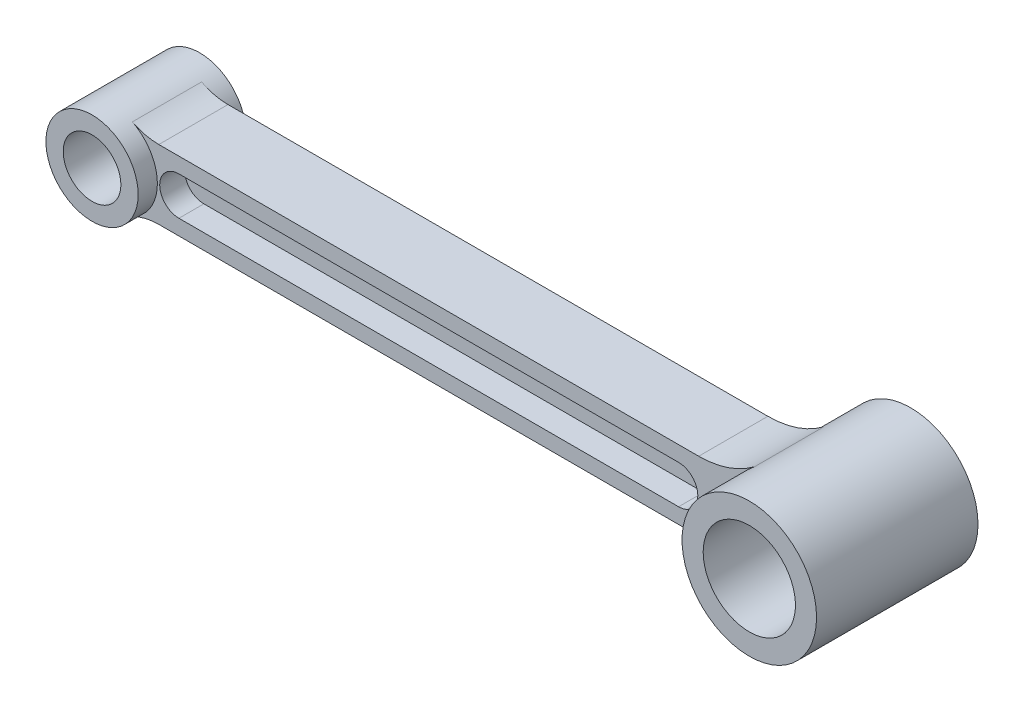
ISO-10303-21;
HEADER;
FILE_DESCRIPTION(('STEP AP214'),'2;1');
FILE_NAME('part.step','',(''),(''),'','','');
FILE_SCHEMA(('AUTOMOTIVE_DESIGN { 1 0 10303 214 1 1 1 1 }'));
ENDSEC;
DATA;
#1=APPLICATION_CONTEXT('core data for automotive mechanical design processes');
#2=APPLICATION_PROTOCOL_DEFINITION('international standard','automotive_design',2000,#1);
#3=PRODUCT_CONTEXT('',#1,'mechanical');
#4=PRODUCT('Part','Part','',(#3));
#5=PRODUCT_RELATED_PRODUCT_CATEGORY('part','',(#4));
#6=PRODUCT_DEFINITION_FORMATION('','',#4);
#7=PRODUCT_DEFINITION_CONTEXT('part definition',#1,'design');
#8=PRODUCT_DEFINITION('design','',#6,#7);
#9=PRODUCT_DEFINITION_SHAPE('','',#8);
#10=(LENGTH_UNIT() NAMED_UNIT(*) SI_UNIT(.MILLI.,.METRE.));
#11=(NAMED_UNIT(*) PLANE_ANGLE_UNIT() SI_UNIT($,.RADIAN.));
#12=(NAMED_UNIT(*) SI_UNIT($,.STERADIAN.) SOLID_ANGLE_UNIT());
#13=UNCERTAINTY_MEASURE_WITH_UNIT(LENGTH_MEASURE(1.E-05),#10,'distance_accuracy_value','');
#14=(GEOMETRIC_REPRESENTATION_CONTEXT(3) GLOBAL_UNCERTAINTY_ASSIGNED_CONTEXT((#13)) GLOBAL_UNIT_ASSIGNED_CONTEXT((#10,
#11,#12)) REPRESENTATION_CONTEXT('',''));
#15=CARTESIAN_POINT('',(0.,0.,0.));
#16=DIRECTION('',(0.,0.,1.));
#17=DIRECTION('',(1.,0.,0.));
#18=AXIS2_PLACEMENT_3D('',#15,#16,#17);
#19=CARTESIAN_POINT('',(0.,0.,-9.));
#20=DIRECTION('',(0.,0.,1.));
#21=DIRECTION('',(1.,0.,0.));
#22=AXIS2_PLACEMENT_3D('',#19,#20,#21);
#23=PLANE('',#22);
#24=CARTESIAN_POINT('',(-46.1087639211392,0.,-9.));
#25=DIRECTION('',(0.,0.,1.));
#26=DIRECTION('',(1.,0.,0.));
#27=AXIS2_PLACEMENT_3D('',#24,#25,#26);
#28=CIRCLE('',#27,12.);
#29=CARTESIAN_POINT('',(-40.611289753649,-10.6666666666667,-9.));
#30=VERTEX_POINT('',#29);
#31=CARTESIAN_POINT('',(-40.611289753649,10.6666666666667,-9.));
#32=VERTEX_POINT('',#31);
#33=EDGE_CURVE('E243',#30,#32,#28,.T.);
#34=ORIENTED_EDGE('',*,*,#33,.T.);
#35=CARTESIAN_POINT('',(-33.7394470442862,24.,-9.));
#36=DIRECTION('',(0.,0.,1.));
#37=DIRECTION('',(1.,0.,0.));
#38=AXIS2_PLACEMENT_3D('',#35,#36,#37);
#39=CIRCLE('',#38,15.);
#40=CARTESIAN_POINT('',(-33.7394470442862,9.,-9.));
#41=VERTEX_POINT('',#40);
#42=EDGE_CURVE('E251',#32,#41,#39,.T.);
#43=ORIENTED_EDGE('',*,*,#42,.T.);
#44=DIRECTION('',(1.,0.,0.));
#45=VECTOR('',#44,1.);
#46=CARTESIAN_POINT('',(0.,9.,-9.));
#47=LINE('',#46,#45);
#48=CARTESIAN_POINT('',(106.726777014538,9.,-9.));
#49=VERTEX_POINT('',#48);
#50=EDGE_CURVE('E298',#41,#49,#47,.T.);
#51=ORIENTED_EDGE('',*,*,#50,.T.);
#52=CARTESIAN_POINT('',(106.726777014538,33.,-9.));
#53=DIRECTION('',(0.,0.,1.));
#54=DIRECTION('',(1.,0.,0.));
#55=AXIS2_PLACEMENT_3D('',#52,#53,#54);
#56=CIRCLE('',#55,24.);
#57=CARTESIAN_POINT('',(121.279717196315,13.9156626506024,-9.));
#58=VERTEX_POINT('',#57);
#59=EDGE_CURVE('E294',#58,#49,#56,.F.);
#60=ORIENTED_EDGE('',*,*,#59,.F.);
#61=CARTESIAN_POINT('',(131.891236078861,0.,-9.));
#62=DIRECTION('',(0.,0.,1.));
#63=DIRECTION('',(1.,0.,0.));
#64=AXIS2_PLACEMENT_3D('',#61,#62,#63);
#65=CIRCLE('',#64,17.5);
#66=CARTESIAN_POINT('',(121.279717196315,-13.9156626506024,-9.));
#67=VERTEX_POINT('',#66);
#68=EDGE_CURVE('E290',#58,#67,#65,.T.);
#69=ORIENTED_EDGE('',*,*,#68,.T.);
#70=CARTESIAN_POINT('',(106.726777014538,-33.,-9.));
#71=DIRECTION('',(0.,0.,1.));
#72=DIRECTION('',(1.,0.,0.));
#73=AXIS2_PLACEMENT_3D('',#70,#71,#72);
#74=CIRCLE('',#73,24.);
#75=CARTESIAN_POINT('',(106.726777014538,-9.,-9.));
#76=VERTEX_POINT('',#75);
#77=EDGE_CURVE('E286',#67,#76,#74,.T.);
#78=ORIENTED_EDGE('',*,*,#77,.T.);
#79=DIRECTION('',(1.,0.,0.));
#80=VECTOR('',#79,1.);
#81=CARTESIAN_POINT('',(0.,-9.,-9.));
#82=LINE('',#81,#80);
#83=CARTESIAN_POINT('',(-33.7394470442862,-9.,-9.));
#84=VERTEX_POINT('',#83);
#85=EDGE_CURVE('E282',#84,#76,#82,.T.);
#86=ORIENTED_EDGE('',*,*,#85,.F.);
#87=CARTESIAN_POINT('',(-33.7394470442862,-24.,-9.));
#88=DIRECTION('',(0.,0.,1.));
#89=DIRECTION('',(1.,0.,0.));
#90=AXIS2_PLACEMENT_3D('',#87,#88,#89);
#91=CIRCLE('',#90,15.);
#92=EDGE_CURVE('E279',#30,#84,#91,.F.);
#93=ORIENTED_EDGE('',*,*,#92,.F.);
#94=EDGE_LOOP('',(#34,#43,#51,#60,#69,#78,#86,#93));
#95=FACE_BOUND('',#94,.T.);
#96=CARTESIAN_POINT('',(101.493664985126,0.,-9.));
#97=DIRECTION('',(0.,0.,1.));
#98=DIRECTION('',(1.,0.,0.));
#99=AXIS2_PLACEMENT_3D('',#96,#97,#98);
#100=CIRCLE('',#99,5.);
#101=CARTESIAN_POINT('',(101.493664985126,5.,-9.));
#102=VERTEX_POINT('',#101);
#103=CARTESIAN_POINT('',(101.493664985126,-5.,-9.));
#104=VERTEX_POINT('',#103);
#105=EDGE_CURVE('E356',#102,#104,#100,.F.);
#106=ORIENTED_EDGE('',*,*,#105,.F.);
#107=DIRECTION('',(1.,0.,0.));
#108=VECTOR('',#107,1.);
#109=CARTESIAN_POINT('',(0.,5.,-9.));
#110=LINE('',#109,#108);
#111=CARTESIAN_POINT('',(-28.5063350148743,5.,-9.));
#112=VERTEX_POINT('',#111);
#113=EDGE_CURVE('E341',#112,#102,#110,.T.);
#114=ORIENTED_EDGE('',*,*,#113,.F.);
#115=CARTESIAN_POINT('',(-28.5063350148743,0.,-9.));
#116=DIRECTION('',(0.,0.,1.));
#117=DIRECTION('',(1.,0.,0.));
#118=AXIS2_PLACEMENT_3D('',#115,#116,#117);
#119=CIRCLE('',#118,5.);
#120=CARTESIAN_POINT('',(-28.5063350148743,-5.,-9.));
#121=VERTEX_POINT('',#120);
#122=EDGE_CURVE('E350',#121,#112,#119,.F.);
#123=ORIENTED_EDGE('',*,*,#122,.F.);
#124=DIRECTION('',(-1.,0.,0.));
#125=VECTOR('',#124,1.);
#126=CARTESIAN_POINT('',(0.,-5.,-9.));
#127=LINE('',#126,#125);
#128=EDGE_CURVE('E353',#104,#121,#127,.T.);
#129=ORIENTED_EDGE('',*,*,#128,.F.);
#130=EDGE_LOOP('',(#106,#114,#123,#129));
#131=FACE_BOUND('',#130,.T.);
#132=ADVANCED_FACE('F51',(#95,#131),#23,.F.);
#133=CARTESIAN_POINT('',(-46.1087639211392,0.,14.));
#134=DIRECTION('',(0.,0.,-1.));
#135=DIRECTION('',(-1.,0.,0.));
#136=AXIS2_PLACEMENT_3D('',#133,#134,#135);
#137=CYLINDRICAL_SURFACE('',#136,12.);
#138=DIRECTION('',(0.,0.,-1.));
#139=VECTOR('',#138,1.);
#140=CARTESIAN_POINT('',(-40.611289753649,-10.6666666666667,9.));
#141=LINE('',#140,#139);
#142=CARTESIAN_POINT('',(-40.611289753649,-10.6666666666667,9.));
#143=VERTEX_POINT('',#142);
#144=EDGE_CURVE('E327',#143,#30,#141,.T.);
#145=ORIENTED_EDGE('',*,*,#144,.F.);
#146=CARTESIAN_POINT('',(-46.1087639211392,0.,9.));
#147=DIRECTION('',(0.,0.,1.));
#148=DIRECTION('',(1.,0.,0.));
#149=AXIS2_PLACEMENT_3D('',#146,#147,#148);
#150=CIRCLE('',#149,12.);
#151=CARTESIAN_POINT('',(-40.611289753649,10.6666666666667,9.));
#152=VERTEX_POINT('',#151);
#153=EDGE_CURVE('E247',#143,#152,#150,.T.);
#154=ORIENTED_EDGE('',*,*,#153,.T.);
#155=DIRECTION('',(0.,0.,-1.));
#156=VECTOR('',#155,1.);
#157=CARTESIAN_POINT('',(-40.611289753649,10.6666666666667,9.));
#158=LINE('',#157,#156);
#159=EDGE_CURVE('E275',#152,#32,#158,.T.);
#160=ORIENTED_EDGE('',*,*,#159,.T.);
#161=ORIENTED_EDGE('',*,*,#33,.F.);
#162=EDGE_LOOP('',(#145,#154,#160,#161));
#163=FACE_BOUND('',#162,.T.);
#164=CARTESIAN_POINT('',(-46.1087639211392,0.,14.));
#165=DIRECTION('',(0.,0.,1.));
#166=DIRECTION('',(1.,0.,0.));
#167=AXIS2_PLACEMENT_3D('',#164,#165,#166);
#168=CIRCLE('',#167,12.);
#169=CARTESIAN_POINT('',(-34.1087639211392,0.,14.));
#170=VERTEX_POINT('',#169);
#171=EDGE_CURVE('E332',#170,#170,#168,.T.);
#172=ORIENTED_EDGE('',*,*,#171,.F.);
#173=EDGE_LOOP('',(#172));
#174=FACE_BOUND('',#173,.T.);
#175=CARTESIAN_POINT('',(-46.1087639211392,0.,-14.));
#176=DIRECTION('',(0.,0.,1.));
#177=DIRECTION('',(1.,0.,0.));
#178=AXIS2_PLACEMENT_3D('',#175,#176,#177);
#179=CIRCLE('',#178,12.);
#180=CARTESIAN_POINT('',(-34.1087639211392,0.,-14.));
#181=VERTEX_POINT('',#180);
#182=EDGE_CURVE('E331',#181,#181,#179,.T.);
#183=ORIENTED_EDGE('',*,*,#182,.T.);
#184=EDGE_LOOP('',(#183));
#185=FACE_BOUND('',#184,.T.);
#186=ADVANCED_FACE('F53',(#163,#174,#185),#137,.T.);
#187=CARTESIAN_POINT('',(-46.1087639211392,0.,14.));
#188=DIRECTION('',(0.,0.,-1.));
#189=DIRECTION('',(-1.,0.,0.));
#190=AXIS2_PLACEMENT_3D('',#187,#188,#189);
#191=CYLINDRICAL_SURFACE('',#190,7.5);
#192=CARTESIAN_POINT('',(-46.1087639211392,0.,14.));
#193=DIRECTION('',(0.,0.,1.));
#194=DIRECTION('',(1.,0.,0.));
#195=AXIS2_PLACEMENT_3D('',#192,#193,#194);
#196=CIRCLE('',#195,7.5);
#197=CARTESIAN_POINT('',(-38.6087639211392,0.,14.));
#198=VERTEX_POINT('',#197);
#199=EDGE_CURVE('E336',#198,#198,#196,.T.);
#200=ORIENTED_EDGE('',*,*,#199,.T.);
#201=EDGE_LOOP('',(#200));
#202=FACE_BOUND('',#201,.T.);
#203=CARTESIAN_POINT('',(-46.1087639211392,0.,-14.));
#204=DIRECTION('',(0.,0.,1.));
#205=DIRECTION('',(1.,0.,0.));
#206=AXIS2_PLACEMENT_3D('',#203,#204,#205);
#207=CIRCLE('',#206,7.5);
#208=CARTESIAN_POINT('',(-38.6087639211392,0.,-14.));
#209=VERTEX_POINT('',#208);
#210=EDGE_CURVE('E337',#209,#209,#207,.T.);
#211=ORIENTED_EDGE('',*,*,#210,.F.);
#212=EDGE_LOOP('',(#211));
#213=FACE_BOUND('',#212,.T.);
#214=ADVANCED_FACE('F387',(#202,#213),#191,.F.);
#215=CARTESIAN_POINT('',(0.,0.,14.));
#216=DIRECTION('',(0.,0.,1.));
#217=DIRECTION('',(1.,0.,0.));
#218=AXIS2_PLACEMENT_3D('',#215,#216,#217);
#219=PLANE('',#218);
#220=ORIENTED_EDGE('',*,*,#171,.T.);
#221=EDGE_LOOP('',(#220));
#222=FACE_BOUND('',#221,.T.);
#223=ORIENTED_EDGE('',*,*,#199,.F.);
#224=EDGE_LOOP('',(#223));
#225=FACE_BOUND('',#224,.T.);
#226=ADVANCED_FACE('F418',(#222,#225),#219,.T.);
#227=CARTESIAN_POINT('',(0.,0.,-14.));
#228=DIRECTION('',(0.,0.,1.));
#229=DIRECTION('',(1.,0.,0.));
#230=AXIS2_PLACEMENT_3D('',#227,#228,#229);
#231=PLANE('',#230);
#232=ORIENTED_EDGE('',*,*,#182,.F.);
#233=EDGE_LOOP('',(#232));
#234=FACE_BOUND('',#233,.T.);
#235=ORIENTED_EDGE('',*,*,#210,.T.);
#236=EDGE_LOOP('',(#235));
#237=FACE_BOUND('',#236,.T.);
#238=ADVANCED_FACE('F416',(#234,#237),#231,.F.);
#239=CARTESIAN_POINT('',(-33.7394470442862,-24.,9.));
#240=DIRECTION('',(0.,0.,-1.));
#241=DIRECTION('',(-1.,0.,0.));
#242=AXIS2_PLACEMENT_3D('',#239,#240,#241);
#243=CYLINDRICAL_SURFACE('',#242,15.);
#244=ORIENTED_EDGE('',*,*,#92,.T.);
#245=DIRECTION('',(0.,0.,-1.));
#246=VECTOR('',#245,1.);
#247=CARTESIAN_POINT('',(-33.7394470442862,-9.,9.));
#248=LINE('',#247,#246);
#249=CARTESIAN_POINT('',(-33.7394470442862,-9.,9.));
#250=VERTEX_POINT('',#249);
#251=EDGE_CURVE('E323',#250,#84,#248,.T.);
#252=ORIENTED_EDGE('',*,*,#251,.F.);
#253=CARTESIAN_POINT('',(-33.7394470442862,-24.,9.));
#254=DIRECTION('',(0.,0.,1.));
#255=DIRECTION('',(1.,0.,0.));
#256=AXIS2_PLACEMENT_3D('',#253,#254,#255);
#257=CIRCLE('',#256,15.);
#258=EDGE_CURVE('E250',#143,#250,#257,.F.);
#259=ORIENTED_EDGE('',*,*,#258,.F.);
#260=ORIENTED_EDGE('',*,*,#144,.T.);
#261=EDGE_LOOP('',(#244,#252,#259,#260));
#262=FACE_BOUND('',#261,.T.);
#263=ADVANCED_FACE('F412',(#262),#243,.F.);
#264=CARTESIAN_POINT('',(0.,-9.,9.));
#265=DIRECTION('',(0.,1.,0.));
#266=DIRECTION('',(-1.,0.,0.));
#267=AXIS2_PLACEMENT_3D('',#264,#265,#266);
#268=PLANE('',#267);
#269=ORIENTED_EDGE('',*,*,#85,.T.);
#270=DIRECTION('',(0.,0.,-1.));
#271=VECTOR('',#270,1.);
#272=CARTESIAN_POINT('',(106.726777014538,-9.,9.));
#273=LINE('',#272,#271);
#274=CARTESIAN_POINT('',(106.726777014538,-9.,9.));
#275=VERTEX_POINT('',#274);
#276=EDGE_CURVE('E320',#275,#76,#273,.T.);
#277=ORIENTED_EDGE('',*,*,#276,.F.);
#278=DIRECTION('',(1.,0.,0.));
#279=VECTOR('',#278,1.);
#280=CARTESIAN_POINT('',(0.,-9.,9.));
#281=LINE('',#280,#279);
#282=EDGE_CURVE('E254',#250,#275,#281,.T.);
#283=ORIENTED_EDGE('',*,*,#282,.F.);
#284=ORIENTED_EDGE('',*,*,#251,.T.);
#285=EDGE_LOOP('',(#269,#277,#283,#284));
#286=FACE_BOUND('',#285,.T.);
#287=ADVANCED_FACE('F408',(#286),#268,.F.);
#288=CARTESIAN_POINT('',(106.726777014538,-33.,9.));
#289=DIRECTION('',(0.,0.,-1.));
#290=DIRECTION('',(-1.,0.,0.));
#291=AXIS2_PLACEMENT_3D('',#288,#289,#290);
#292=CYLINDRICAL_SURFACE('',#291,24.);
#293=ORIENTED_EDGE('',*,*,#77,.F.);
#294=DIRECTION('',(0.,0.,-1.));
#295=VECTOR('',#294,1.);
#296=CARTESIAN_POINT('',(121.279717196315,-13.9156626506024,9.));
#297=LINE('',#296,#295);
#298=CARTESIAN_POINT('',(121.279717196315,-13.9156626506024,9.));
#299=VERTEX_POINT('',#298);
#300=EDGE_CURVE('E317',#299,#67,#297,.T.);
#301=ORIENTED_EDGE('',*,*,#300,.F.);
#302=CARTESIAN_POINT('',(106.726777014538,-33.,9.));
#303=DIRECTION('',(0.,0.,1.));
#304=DIRECTION('',(1.,0.,0.));
#305=AXIS2_PLACEMENT_3D('',#302,#303,#304);
#306=CIRCLE('',#305,24.);
#307=EDGE_CURVE('E257',#299,#275,#306,.T.);
#308=ORIENTED_EDGE('',*,*,#307,.T.);
#309=ORIENTED_EDGE('',*,*,#276,.T.);
#310=EDGE_LOOP('',(#293,#301,#308,#309));
#311=FACE_BOUND('',#310,.T.);
#312=ADVANCED_FACE('F404',(#311),#292,.F.);
#313=CARTESIAN_POINT('',(106.726777014538,33.,9.));
#314=DIRECTION('',(0.,0.,-1.));
#315=DIRECTION('',(-1.,0.,0.));
#316=AXIS2_PLACEMENT_3D('',#313,#314,#315);
#317=CYLINDRICAL_SURFACE('',#316,24.);
#318=ORIENTED_EDGE('',*,*,#59,.T.);
#319=DIRECTION('',(0.,0.,-1.));
#320=VECTOR('',#319,1.);
#321=CARTESIAN_POINT('',(106.726777014538,9.,9.));
#322=LINE('',#321,#320);
#323=CARTESIAN_POINT('',(106.726777014538,9.,9.));
#324=VERTEX_POINT('',#323);
#325=EDGE_CURVE('E310',#324,#49,#322,.T.);
#326=ORIENTED_EDGE('',*,*,#325,.F.);
#327=CARTESIAN_POINT('',(106.726777014538,33.,9.));
#328=DIRECTION('',(0.,0.,1.));
#329=DIRECTION('',(1.,0.,0.));
#330=AXIS2_PLACEMENT_3D('',#327,#328,#329);
#331=CIRCLE('',#330,24.);
#332=CARTESIAN_POINT('',(121.279717196315,13.9156626506024,9.));
#333=VERTEX_POINT('',#332);
#334=EDGE_CURVE('E264',#333,#324,#331,.F.);
#335=ORIENTED_EDGE('',*,*,#334,.F.);
#336=DIRECTION('',(0.,0.,-1.));
#337=VECTOR('',#336,1.);
#338=CARTESIAN_POINT('',(121.279717196315,13.9156626506024,9.));
#339=LINE('',#338,#337);
#340=EDGE_CURVE('E313',#333,#58,#339,.T.);
#341=ORIENTED_EDGE('',*,*,#340,.T.);
#342=EDGE_LOOP('',(#318,#326,#335,#341));
#343=FACE_BOUND('',#342,.T.);
#344=ADVANCED_FACE('F400',(#343),#317,.F.);
#345=CARTESIAN_POINT('',(0.,9.,9.));
#346=DIRECTION('',(0.,1.,0.));
#347=DIRECTION('',(-1.,0.,0.));
#348=AXIS2_PLACEMENT_3D('',#345,#346,#347);
#349=PLANE('',#348);
#350=ORIENTED_EDGE('',*,*,#50,.F.);
#351=DIRECTION('',(0.,0.,-1.));
#352=VECTOR('',#351,1.);
#353=CARTESIAN_POINT('',(-33.7394470442862,9.,9.));
#354=LINE('',#353,#352);
#355=CARTESIAN_POINT('',(-33.7394470442862,9.,9.));
#356=VERTEX_POINT('',#355);
#357=EDGE_CURVE('E307',#356,#41,#354,.T.);
#358=ORIENTED_EDGE('',*,*,#357,.F.);
#359=DIRECTION('',(1.,0.,0.));
#360=VECTOR('',#359,1.);
#361=CARTESIAN_POINT('',(0.,9.,9.));
#362=LINE('',#361,#360);
#363=EDGE_CURVE('E267',#356,#324,#362,.T.);
#364=ORIENTED_EDGE('',*,*,#363,.T.);
#365=ORIENTED_EDGE('',*,*,#325,.T.);
#366=EDGE_LOOP('',(#350,#358,#364,#365));
#367=FACE_BOUND('',#366,.T.);
#368=ADVANCED_FACE('F396',(#367),#349,.T.);
#369=CARTESIAN_POINT('',(-33.7394470442862,24.,9.));
#370=DIRECTION('',(0.,0.,-1.));
#371=DIRECTION('',(-1.,0.,0.));
#372=AXIS2_PLACEMENT_3D('',#369,#370,#371);
#373=CYLINDRICAL_SURFACE('',#372,15.);
#374=ORIENTED_EDGE('',*,*,#42,.F.);
#375=ORIENTED_EDGE('',*,*,#159,.F.);
#376=CARTESIAN_POINT('',(-33.7394470442862,24.,9.));
#377=DIRECTION('',(0.,0.,1.));
#378=DIRECTION('',(1.,0.,0.));
#379=AXIS2_PLACEMENT_3D('',#376,#377,#378);
#380=CIRCLE('',#379,15.);
#381=EDGE_CURVE('E271',#152,#356,#380,.T.);
#382=ORIENTED_EDGE('',*,*,#381,.T.);
#383=ORIENTED_EDGE('',*,*,#357,.T.);
#384=EDGE_LOOP('',(#374,#375,#382,#383));
#385=FACE_BOUND('',#384,.T.);
#386=ADVANCED_FACE('F393',(#385),#373,.F.);
#387=CARTESIAN_POINT('',(0.,0.,9.));
#388=DIRECTION('',(0.,0.,1.));
#389=DIRECTION('',(1.,0.,0.));
#390=AXIS2_PLACEMENT_3D('',#387,#388,#389);
#391=PLANE('',#390);
#392=CARTESIAN_POINT('',(101.493664985126,0.,9.));
#393=DIRECTION('',(0.,0.,1.));
#394=DIRECTION('',(1.,0.,0.));
#395=AXIS2_PLACEMENT_3D('',#392,#393,#394);
#396=CIRCLE('',#395,5.);
#397=CARTESIAN_POINT('',(101.493664985126,-5.,9.));
#398=VERTEX_POINT('',#397);
#399=CARTESIAN_POINT('',(101.493664985126,5.,9.));
#400=VERTEX_POINT('',#399);
#401=EDGE_CURVE('E12',#398,#400,#396,.T.);
#402=ORIENTED_EDGE('',*,*,#401,.F.);
#403=DIRECTION('',(1.,0.,0.));
#404=VECTOR('',#403,1.);
#405=CARTESIAN_POINT('',(0.,-5.,9.));
#406=LINE('',#405,#404);
#407=CARTESIAN_POINT('',(-28.5063350148743,-5.,9.));
#408=VERTEX_POINT('',#407);
#409=EDGE_CURVE('E359',#408,#398,#406,.T.);
#410=ORIENTED_EDGE('',*,*,#409,.F.);
#411=CARTESIAN_POINT('',(-28.5063350148743,0.,9.));
#412=DIRECTION('',(0.,0.,1.));
#413=DIRECTION('',(1.,0.,0.));
#414=AXIS2_PLACEMENT_3D('',#411,#412,#413);
#415=CIRCLE('',#414,5.);
#416=CARTESIAN_POINT('',(-28.5063350148743,5.,9.));
#417=VERTEX_POINT('',#416);
#418=EDGE_CURVE('E362',#417,#408,#415,.T.);
#419=ORIENTED_EDGE('',*,*,#418,.F.);
#420=DIRECTION('',(-1.,0.,0.));
#421=VECTOR('',#420,1.);
#422=CARTESIAN_POINT('',(0.,5.,9.));
#423=LINE('',#422,#421);
#424=EDGE_CURVE('E60',#400,#417,#423,.T.);
#425=ORIENTED_EDGE('',*,*,#424,.F.);
#426=EDGE_LOOP('',(#402,#410,#419,#425));
#427=FACE_BOUND('',#426,.T.);
#428=ORIENTED_EDGE('',*,*,#153,.F.);
#429=ORIENTED_EDGE('',*,*,#258,.T.);
#430=ORIENTED_EDGE('',*,*,#282,.T.);
#431=ORIENTED_EDGE('',*,*,#307,.F.);
#432=CARTESIAN_POINT('',(131.891236078861,0.,9.));
#433=DIRECTION('',(0.,0.,1.));
#434=DIRECTION('',(1.,0.,0.));
#435=AXIS2_PLACEMENT_3D('',#432,#433,#434);
#436=CIRCLE('',#435,17.5);
#437=EDGE_CURVE('E261',#333,#299,#436,.T.);
#438=ORIENTED_EDGE('',*,*,#437,.F.);
#439=ORIENTED_EDGE('',*,*,#334,.T.);
#440=ORIENTED_EDGE('',*,*,#363,.F.);
#441=ORIENTED_EDGE('',*,*,#381,.F.);
#442=EDGE_LOOP('',(#428,#429,#430,#431,#438,#439,#440,#441));
#443=FACE_BOUND('',#442,.T.);
#444=ADVANCED_FACE('F370',(#427,#443),#391,.T.);
#445=CARTESIAN_POINT('',(131.891236078861,0.,21.));
#446=DIRECTION('',(0.,0.,1.));
#447=DIRECTION('',(1.,0.,0.));
#448=AXIS2_PLACEMENT_3D('',#445,#446,#447);
#449=PLANE('',#448);
#450=CARTESIAN_POINT('',(131.891236078861,0.,21.));
#451=DIRECTION('',(0.,0.,1.));
#452=DIRECTION('',(1.,0.,0.));
#453=AXIS2_PLACEMENT_3D('',#450,#451,#452);
#454=CIRCLE('',#453,17.5);
#455=CARTESIAN_POINT('',(149.391236078861,0.,21.));
#456=VERTEX_POINT('',#455);
#457=EDGE_CURVE('E239',#456,#456,#454,.T.);
#458=ORIENTED_EDGE('',*,*,#457,.T.);
#459=EDGE_LOOP('',(#458));
#460=FACE_BOUND('',#459,.T.);
#461=CARTESIAN_POINT('',(131.891236078861,0.,21.));
#462=DIRECTION('',(0.,0.,1.));
#463=DIRECTION('',(1.,0.,0.));
#464=AXIS2_PLACEMENT_3D('',#461,#462,#463);
#465=CIRCLE('',#464,12.);
#466=CARTESIAN_POINT('',(119.891236078861,0.,21.));
#467=VERTEX_POINT('',#466);
#468=EDGE_CURVE('E231',#467,#467,#465,.T.);
#469=ORIENTED_EDGE('',*,*,#468,.F.);
#470=EDGE_LOOP('',(#469));
#471=FACE_BOUND('',#470,.T.);
#472=ADVANCED_FACE('F474',(#460,#471),#449,.T.);
#473=CARTESIAN_POINT('',(131.891236078861,0.,-21.));
#474=DIRECTION('',(0.,0.,1.));
#475=DIRECTION('',(1.,0.,0.));
#476=AXIS2_PLACEMENT_3D('',#473,#474,#475);
#477=PLANE('',#476);
#478=CARTESIAN_POINT('',(131.891236078861,0.,-21.));
#479=DIRECTION('',(0.,0.,1.));
#480=DIRECTION('',(1.,0.,0.));
#481=AXIS2_PLACEMENT_3D('',#478,#479,#480);
#482=CIRCLE('',#481,17.5);
#483=CARTESIAN_POINT('',(149.391236078861,0.,-21.));
#484=VERTEX_POINT('',#483);
#485=EDGE_CURVE('E235',#484,#484,#482,.T.);
#486=ORIENTED_EDGE('',*,*,#485,.F.);
#487=EDGE_LOOP('',(#486));
#488=FACE_BOUND('',#487,.T.);
#489=CARTESIAN_POINT('',(131.891236078861,0.,-21.));
#490=DIRECTION('',(0.,0.,1.));
#491=DIRECTION('',(1.,0.,0.));
#492=AXIS2_PLACEMENT_3D('',#489,#490,#491);
#493=CIRCLE('',#492,12.);
#494=CARTESIAN_POINT('',(119.891236078861,0.,-21.));
#495=VERTEX_POINT('',#494);
#496=EDGE_CURVE('E230',#495,#495,#493,.T.);
#497=ORIENTED_EDGE('',*,*,#496,.T.);
#498=EDGE_LOOP('',(#497));
#499=FACE_BOUND('',#498,.T.);
#500=ADVANCED_FACE('F481',(#488,#499),#477,.F.);
#501=CARTESIAN_POINT('',(131.891236078861,0.,21.));
#502=DIRECTION('',(0.,0.,-1.));
#503=DIRECTION('',(-1.,0.,0.));
#504=AXIS2_PLACEMENT_3D('',#501,#502,#503);
#505=CYLINDRICAL_SURFACE('',#504,17.5);
#506=ORIENTED_EDGE('',*,*,#437,.T.);
#507=ORIENTED_EDGE('',*,*,#300,.T.);
#508=ORIENTED_EDGE('',*,*,#68,.F.);
#509=ORIENTED_EDGE('',*,*,#340,.F.);
#510=EDGE_LOOP('',(#506,#507,#508,#509));
#511=FACE_BOUND('',#510,.T.);
#512=ORIENTED_EDGE('',*,*,#457,.F.);
#513=EDGE_LOOP('',(#512));
#514=FACE_BOUND('',#513,.T.);
#515=ORIENTED_EDGE('',*,*,#485,.T.);
#516=EDGE_LOOP('',(#515));
#517=FACE_BOUND('',#516,.T.);
#518=ADVANCED_FACE('F489',(#511,#514,#517),#505,.T.);
#519=CARTESIAN_POINT('',(131.891236078861,0.,21.));
#520=DIRECTION('',(0.,0.,-1.));
#521=DIRECTION('',(-1.,0.,0.));
#522=AXIS2_PLACEMENT_3D('',#519,#520,#521);
#523=CYLINDRICAL_SURFACE('',#522,12.);
#524=CARTESIAN_POINT('',(119.891236078861,0.,21.));
#525=CARTESIAN_POINT('',(119.891236078861,0.,20.5625));
#526=CARTESIAN_POINT('',(119.891236078861,0.,20.125));
#527=CARTESIAN_POINT('',(119.891236078861,0.,19.25));
#528=CARTESIAN_POINT('',(119.891236078861,0.,18.8125));
#529=CARTESIAN_POINT('',(119.891236078861,0.,17.9375));
#530=CARTESIAN_POINT('',(119.891236078861,0.,17.5));
#531=CARTESIAN_POINT('',(119.891236078861,0.,16.625));
#532=CARTESIAN_POINT('',(119.891236078861,0.,16.1875));
#533=CARTESIAN_POINT('',(119.891236078861,0.,15.3125));
#534=CARTESIAN_POINT('',(119.891236078861,0.,14.875));
#535=CARTESIAN_POINT('',(119.891236078861,0.,14.));
#536=CARTESIAN_POINT('',(119.891236078861,0.,13.5625));
#537=CARTESIAN_POINT('',(119.891236078861,0.,12.6875));
#538=CARTESIAN_POINT('',(119.891236078861,0.,12.25));
#539=CARTESIAN_POINT('',(119.891236078861,0.,11.375));
#540=CARTESIAN_POINT('',(119.891236078861,0.,10.9375));
#541=CARTESIAN_POINT('',(119.891236078861,0.,10.0625));
#542=CARTESIAN_POINT('',(119.891236078861,0.,9.625));
#543=CARTESIAN_POINT('',(119.891236078861,0.,8.75));
#544=CARTESIAN_POINT('',(119.891236078861,0.,8.3125));
#545=CARTESIAN_POINT('',(119.891236078861,0.,7.4375));
#546=CARTESIAN_POINT('',(119.891236078861,0.,7.));
#547=CARTESIAN_POINT('',(119.891236078861,0.,6.125));
#548=CARTESIAN_POINT('',(119.891236078861,0.,5.6875));
#549=CARTESIAN_POINT('',(119.891236078861,0.,4.8125));
#550=CARTESIAN_POINT('',(119.891236078861,0.,4.375));
#551=CARTESIAN_POINT('',(119.891236078861,0.,3.5));
#552=CARTESIAN_POINT('',(119.891236078861,0.,3.0625));
#553=CARTESIAN_POINT('',(119.891236078861,0.,2.1875));
#554=CARTESIAN_POINT('',(119.891236078861,0.,1.75));
#555=CARTESIAN_POINT('',(119.891236078861,0.,0.874999999999997));
#556=CARTESIAN_POINT('',(119.891236078861,0.,0.437499999999997));
#557=CARTESIAN_POINT('',(119.891236078861,0.,-0.437500000000004));
#558=CARTESIAN_POINT('',(119.891236078861,0.,-0.875000000000004));
#559=CARTESIAN_POINT('',(119.891236078861,0.,-1.75000000000001));
#560=CARTESIAN_POINT('',(119.891236078861,0.,-2.18750000000001));
#561=CARTESIAN_POINT('',(119.891236078861,0.,-3.0625));
#562=CARTESIAN_POINT('',(119.891236078861,0.,-3.5));
#563=CARTESIAN_POINT('',(119.891236078861,0.,-4.375));
#564=CARTESIAN_POINT('',(119.891236078861,0.,-4.8125));
#565=CARTESIAN_POINT('',(119.891236078861,0.,-5.68750000000001));
#566=CARTESIAN_POINT('',(119.891236078861,0.,-6.12500000000001));
#567=CARTESIAN_POINT('',(119.891236078861,0.,-7.00000000000001));
#568=CARTESIAN_POINT('',(119.891236078861,0.,-7.4375));
#569=CARTESIAN_POINT('',(119.891236078861,0.,-8.3125));
#570=CARTESIAN_POINT('',(119.891236078861,0.,-8.75));
#571=CARTESIAN_POINT('',(119.891236078861,0.,-9.625));
#572=CARTESIAN_POINT('',(119.891236078861,0.,-10.0625));
#573=CARTESIAN_POINT('',(119.891236078861,0.,-10.9375));
#574=CARTESIAN_POINT('',(119.891236078861,0.,-11.375));
#575=CARTESIAN_POINT('',(119.891236078861,0.,-12.25));
#576=CARTESIAN_POINT('',(119.891236078861,0.,-12.6875));
#577=CARTESIAN_POINT('',(119.891236078861,0.,-13.5625));
#578=CARTESIAN_POINT('',(119.891236078861,0.,-14.));
#579=CARTESIAN_POINT('',(119.891236078861,0.,-14.875));
#580=CARTESIAN_POINT('',(119.891236078861,0.,-15.3125));
#581=CARTESIAN_POINT('',(119.891236078861,0.,-16.1875));
#582=CARTESIAN_POINT('',(119.891236078861,0.,-16.625));
#583=CARTESIAN_POINT('',(119.891236078861,0.,-17.5));
#584=CARTESIAN_POINT('',(119.891236078861,0.,-17.9375));
#585=CARTESIAN_POINT('',(119.891236078861,0.,-18.8125));
#586=CARTESIAN_POINT('',(119.891236078861,0.,-19.25));
#587=CARTESIAN_POINT('',(119.891236078861,0.,-20.125));
#588=CARTESIAN_POINT('',(119.891236078861,0.,-20.5625));
#589=CARTESIAN_POINT('',(119.891236078861,0.,-21.));
#590=B_SPLINE_CURVE_WITH_KNOTS('',3,(#524,#525,#526,#527,#528,#529,#530,#531,#532,#533,#534,
#535,#536,#537,#538,#539,#540,#541,#542,#543,#544,#545,#546,#547,#548,#549,#550,#551,#552,#553,
#554,#555,#556,#557,#558,#559,#560,#561,#562,#563,#564,#565,#566,#567,#568,#569,#570,#571,#572,
#573,#574,#575,#576,#577,#578,#579,#580,#581,#582,#583,#584,#585,#586,#587,#588,#589),
.UNSPECIFIED.,.F.,.F.,(4,2,2,2,2,2,2,2,2,2,2,2,2,2,2,2,2,2,2,2,2,2,2,2,2,2,2,2,2,2,2,2,4),(0.,
1.3125,2.625,3.9375,5.25,6.5625,7.875,9.1875,10.5,11.8125,13.125,14.4375,15.75,17.0625,18.375,
19.6875,21.,22.3125,23.625,24.9375,26.25,27.5625,28.875,30.1875,31.5,32.8125,34.125,35.4375,
36.75,38.0625,39.375,40.6875,42.),.UNSPECIFIED.);
#591=EDGE_CURVE('BSEAM497',#467,#495,#590,.T.);
#592=ORIENTED_EDGE('',*,*,#468,.T.);
#593=ORIENTED_EDGE('',*,*,#496,.F.);
#594=ORIENTED_EDGE('',*,*,#591,.T.);
#595=ORIENTED_EDGE('',*,*,#591,.F.);
#596=EDGE_LOOP('',(#592,#594,#593,#595));
#597=FACE_BOUND('',#596,.T.);
#598=ADVANCED_FACE('F497',(#597),#523,.F.);
#599=CARTESIAN_POINT('',(101.493664985126,0.,-20.5));
#600=DIRECTION('',(0.,0.,1.));
#601=DIRECTION('',(1.,0.,0.));
#602=AXIS2_PLACEMENT_3D('',#599,#600,#601);
#603=CYLINDRICAL_SURFACE('',#602,5.);
#604=ORIENTED_EDGE('',*,*,#105,.T.);
#605=DIRECTION('',(0.,0.,1.));
#606=VECTOR('',#605,1.);
#607=CARTESIAN_POINT('',(101.493664985126,-5.,-20.5));
#608=LINE('',#607,#606);
#609=CARTESIAN_POINT('',(101.493664985126,-5.,-2.5));
#610=VERTEX_POINT('',#609);
#611=EDGE_CURVE('E227',#104,#610,#608,.T.);
#612=ORIENTED_EDGE('',*,*,#611,.T.);
#613=CARTESIAN_POINT('',(101.493664985126,0.,-2.5));
#614=DIRECTION('',(0.,0.,-1.));
#615=DIRECTION('',(-1.,0.,0.));
#616=AXIS2_PLACEMENT_3D('',#613,#614,#615);
#617=CIRCLE('',#616,5.);
#618=CARTESIAN_POINT('',(101.493664985126,5.,-2.5));
#619=VERTEX_POINT('',#618);
#620=EDGE_CURVE('E175',#619,#610,#617,.T.);
#621=ORIENTED_EDGE('',*,*,#620,.F.);
#622=DIRECTION('',(0.,0.,1.));
#623=VECTOR('',#622,1.);
#624=CARTESIAN_POINT('',(101.493664985126,5.,-20.5));
#625=LINE('',#624,#623);
#626=EDGE_CURVE('E219',#102,#619,#625,.T.);
#627=ORIENTED_EDGE('',*,*,#626,.F.);
#628=EDGE_LOOP('',(#604,#612,#621,#627));
#629=FACE_BOUND('',#628,.T.);
#630=ADVANCED_FACE('F504',(#629),#603,.F.);
#631=CARTESIAN_POINT('',(101.493664985126,-5.,-20.5));
#632=DIRECTION('',(0.,1.,0.));
#633=DIRECTION('',(0.,0.,1.));
#634=AXIS2_PLACEMENT_3D('',#631,#632,#633);
#635=PLANE('',#634);
#636=ORIENTED_EDGE('',*,*,#128,.T.);
#637=DIRECTION('',(0.,0.,1.));
#638=VECTOR('',#637,1.);
#639=CARTESIAN_POINT('',(-28.5063350148743,-5.,-20.5));
#640=LINE('',#639,#638);
#641=CARTESIAN_POINT('',(-28.5063350148743,-5.,-2.5));
#642=VERTEX_POINT('',#641);
#643=EDGE_CURVE('E224',#121,#642,#640,.T.);
#644=ORIENTED_EDGE('',*,*,#643,.T.);
#645=DIRECTION('',(-1.,0.,0.));
#646=VECTOR('',#645,1.);
#647=CARTESIAN_POINT('',(101.493664985126,-5.,-2.5));
#648=LINE('',#647,#646);
#649=EDGE_CURVE('E207',#610,#642,#648,.T.);
#650=ORIENTED_EDGE('',*,*,#649,.F.);
#651=ORIENTED_EDGE('',*,*,#611,.F.);
#652=EDGE_LOOP('',(#636,#644,#650,#651));
#653=FACE_BOUND('',#652,.T.);
#654=ADVANCED_FACE('F512',(#653),#635,.T.);
#655=CARTESIAN_POINT('',(-28.5063350148743,0.,-20.5));
#656=DIRECTION('',(0.,0.,1.));
#657=DIRECTION('',(1.,0.,0.));
#658=AXIS2_PLACEMENT_3D('',#655,#656,#657);
#659=CYLINDRICAL_SURFACE('',#658,5.);
#660=ORIENTED_EDGE('',*,*,#122,.T.);
#661=DIRECTION('',(0.,0.,1.));
#662=VECTOR('',#661,1.);
#663=CARTESIAN_POINT('',(-28.5063350148743,5.,-20.5));
#664=LINE('',#663,#662);
#665=CARTESIAN_POINT('',(-28.5063350148743,5.,-2.5));
#666=VERTEX_POINT('',#665);
#667=EDGE_CURVE('E75',#112,#666,#664,.T.);
#668=ORIENTED_EDGE('',*,*,#667,.T.);
#669=CARTESIAN_POINT('',(-28.5063350148743,0.,-2.5));
#670=DIRECTION('',(0.,0.,-1.));
#671=DIRECTION('',(-1.,0.,0.));
#672=AXIS2_PLACEMENT_3D('',#669,#670,#671);
#673=CIRCLE('',#672,5.);
#674=EDGE_CURVE('E211',#642,#666,#673,.T.);
#675=ORIENTED_EDGE('',*,*,#674,.F.);
#676=ORIENTED_EDGE('',*,*,#643,.F.);
#677=EDGE_LOOP('',(#660,#668,#675,#676));
#678=FACE_BOUND('',#677,.T.);
#679=ADVANCED_FACE('F520',(#678),#659,.F.);
#680=CARTESIAN_POINT('',(101.493664985126,5.,-20.5));
#681=DIRECTION('',(0.,-1.,0.));
#682=DIRECTION('',(0.,0.,-1.));
#683=AXIS2_PLACEMENT_3D('',#680,#681,#682);
#684=PLANE('',#683);
#685=ORIENTED_EDGE('',*,*,#113,.T.);
#686=ORIENTED_EDGE('',*,*,#626,.T.);
#687=DIRECTION('',(1.,0.,0.));
#688=VECTOR('',#687,1.);
#689=CARTESIAN_POINT('',(101.493664985126,5.,-2.5));
#690=LINE('',#689,#688);
#691=EDGE_CURVE('E215',#666,#619,#690,.T.);
#692=ORIENTED_EDGE('',*,*,#691,.F.);
#693=ORIENTED_EDGE('',*,*,#667,.F.);
#694=EDGE_LOOP('',(#685,#686,#692,#693));
#695=FACE_BOUND('',#694,.T.);
#696=ADVANCED_FACE('F528',(#695),#684,.T.);
#697=CARTESIAN_POINT('',(101.493664985126,0.,-2.5));
#698=DIRECTION('',(0.,0.,-1.));
#699=DIRECTION('',(-1.,0.,0.));
#700=AXIS2_PLACEMENT_3D('',#697,#698,#699);
#701=PLANE('',#700);
#702=ORIENTED_EDGE('',*,*,#620,.T.);
#703=ORIENTED_EDGE('',*,*,#649,.T.);
#704=ORIENTED_EDGE('',*,*,#674,.T.);
#705=ORIENTED_EDGE('',*,*,#691,.T.);
#706=EDGE_LOOP('',(#702,#703,#704,#705));
#707=FACE_BOUND('',#706,.T.);
#708=ADVANCED_FACE('F536',(#707),#701,.T.);
#709=CARTESIAN_POINT('',(101.493664985126,0.,20.5));
#710=DIRECTION('',(0.,0.,-1.));
#711=DIRECTION('',(-1.,0.,0.));
#712=AXIS2_PLACEMENT_3D('',#709,#710,#711);
#713=CYLINDRICAL_SURFACE('',#712,5.);
#714=ORIENTED_EDGE('',*,*,#401,.T.);
#715=DIRECTION('',(0.,0.,-1.));
#716=VECTOR('',#715,1.);
#717=CARTESIAN_POINT('',(101.493664985126,5.,20.5));
#718=LINE('',#717,#716);
#719=CARTESIAN_POINT('',(101.493664985126,5.,2.5));
#720=VERTEX_POINT('',#719);
#721=EDGE_CURVE('E164',#400,#720,#718,.T.);
#722=ORIENTED_EDGE('',*,*,#721,.T.);
#723=CARTESIAN_POINT('',(101.493664985126,0.,2.5));
#724=DIRECTION('',(0.,0.,-1.));
#725=DIRECTION('',(-1.,0.,0.));
#726=AXIS2_PLACEMENT_3D('',#723,#724,#725);
#727=CIRCLE('',#726,5.);
#728=CARTESIAN_POINT('',(101.493664985126,-5.,2.5));
#729=VERTEX_POINT('',#728);
#730=EDGE_CURVE('E168',#720,#729,#727,.T.);
#731=ORIENTED_EDGE('',*,*,#730,.T.);
#732=DIRECTION('',(0.,0.,-1.));
#733=VECTOR('',#732,1.);
#734=CARTESIAN_POINT('',(101.493664985126,-5.,20.5));
#735=LINE('',#734,#733);
#736=EDGE_CURVE('E197',#398,#729,#735,.T.);
#737=ORIENTED_EDGE('',*,*,#736,.F.);
#738=EDGE_LOOP('',(#714,#722,#731,#737));
#739=FACE_BOUND('',#738,.T.);
#740=ADVANCED_FACE('F166',(#739),#713,.F.);
#741=CARTESIAN_POINT('',(101.493664985126,5.,20.5));
#742=DIRECTION('',(0.,1.,0.));
#743=DIRECTION('',(0.,0.,1.));
#744=AXIS2_PLACEMENT_3D('',#741,#742,#743);
#745=PLANE('',#744);
#746=ORIENTED_EDGE('',*,*,#424,.T.);
#747=DIRECTION('',(0.,0.,-1.));
#748=VECTOR('',#747,1.);
#749=CARTESIAN_POINT('',(-28.5063350148743,5.,20.5));
#750=LINE('',#749,#748);
#751=CARTESIAN_POINT('',(-28.5063350148743,5.,2.5));
#752=VERTEX_POINT('',#751);
#753=EDGE_CURVE('E176',#417,#752,#750,.T.);
#754=ORIENTED_EDGE('',*,*,#753,.T.);
#755=DIRECTION('',(1.,0.,0.));
#756=VECTOR('',#755,1.);
#757=CARTESIAN_POINT('',(101.493664985126,5.,2.5));
#758=LINE('',#757,#756);
#759=EDGE_CURVE('E182',#752,#720,#758,.T.);
#760=ORIENTED_EDGE('',*,*,#759,.T.);
#761=ORIENTED_EDGE('',*,*,#721,.F.);
#762=EDGE_LOOP('',(#746,#754,#760,#761));
#763=FACE_BOUND('',#762,.T.);
#764=ADVANCED_FACE('F187',(#763),#745,.F.);
#765=CARTESIAN_POINT('',(-28.5063350148743,0.,20.5));
#766=DIRECTION('',(0.,0.,-1.));
#767=DIRECTION('',(-1.,0.,0.));
#768=AXIS2_PLACEMENT_3D('',#765,#766,#767);
#769=CYLINDRICAL_SURFACE('',#768,5.);
#770=ORIENTED_EDGE('',*,*,#418,.T.);
#771=DIRECTION('',(0.,0.,-1.));
#772=VECTOR('',#771,1.);
#773=CARTESIAN_POINT('',(-28.5063350148743,-5.,20.5));
#774=LINE('',#773,#772);
#775=CARTESIAN_POINT('',(-28.5063350148743,-5.,2.5));
#776=VERTEX_POINT('',#775);
#777=EDGE_CURVE('E67',#408,#776,#774,.T.);
#778=ORIENTED_EDGE('',*,*,#777,.T.);
#779=CARTESIAN_POINT('',(-28.5063350148743,0.,2.5));
#780=DIRECTION('',(0.,0.,-1.));
#781=DIRECTION('',(-1.,0.,0.));
#782=AXIS2_PLACEMENT_3D('',#779,#780,#781);
#783=CIRCLE('',#782,5.);
#784=EDGE_CURVE('E190',#776,#752,#783,.T.);
#785=ORIENTED_EDGE('',*,*,#784,.T.);
#786=ORIENTED_EDGE('',*,*,#753,.F.);
#787=EDGE_LOOP('',(#770,#778,#785,#786));
#788=FACE_BOUND('',#787,.T.);
#789=ADVANCED_FACE('F368',(#788),#769,.F.);
#790=CARTESIAN_POINT('',(101.493664985126,-5.,20.5));
#791=DIRECTION('',(0.,-1.,0.));
#792=DIRECTION('',(0.,0.,-1.));
#793=AXIS2_PLACEMENT_3D('',#790,#791,#792);
#794=PLANE('',#793);
#795=ORIENTED_EDGE('',*,*,#409,.T.);
#796=ORIENTED_EDGE('',*,*,#736,.T.);
#797=DIRECTION('',(-1.,0.,0.));
#798=VECTOR('',#797,1.);
#799=CARTESIAN_POINT('',(101.493664985126,-5.,2.5));
#800=LINE('',#799,#798);
#801=EDGE_CURVE('E184',#729,#776,#800,.T.);
#802=ORIENTED_EDGE('',*,*,#801,.T.);
#803=ORIENTED_EDGE('',*,*,#777,.F.);
#804=EDGE_LOOP('',(#795,#796,#802,#803));
#805=FACE_BOUND('',#804,.T.);
#806=ADVANCED_FACE('F372',(#805),#794,.F.);
#807=CARTESIAN_POINT('',(101.493664985126,0.,2.5));
#808=DIRECTION('',(0.,0.,1.));
#809=DIRECTION('',(-1.,0.,0.));
#810=AXIS2_PLACEMENT_3D('',#807,#808,#809);
#811=PLANE('',#810);
#812=ORIENTED_EDGE('',*,*,#730,.F.);
#813=ORIENTED_EDGE('',*,*,#759,.F.);
#814=ORIENTED_EDGE('',*,*,#784,.F.);
#815=ORIENTED_EDGE('',*,*,#801,.F.);
#816=EDGE_LOOP('',(#812,#813,#814,#815));
#817=FACE_BOUND('',#816,.T.);
#818=ADVANCED_FACE('F180',(#817),#811,.T.);
#819=CLOSED_SHELL('',(#132,#186,#214,#226,#238,#263,#287,#312,#344,#368,#386,#444,#472,#500,
#518,#598,#630,#654,#679,#696,#708,#740,#764,#789,#806,#818));
#820=MANIFOLD_SOLID_BREP('B2',#819);
#821=ADVANCED_BREP_SHAPE_REPRESENTATION('',(#18,#820),#14);
#822=SHAPE_DEFINITION_REPRESENTATION(#9,#821);
ENDSEC;
END-ISO-10303-21;
